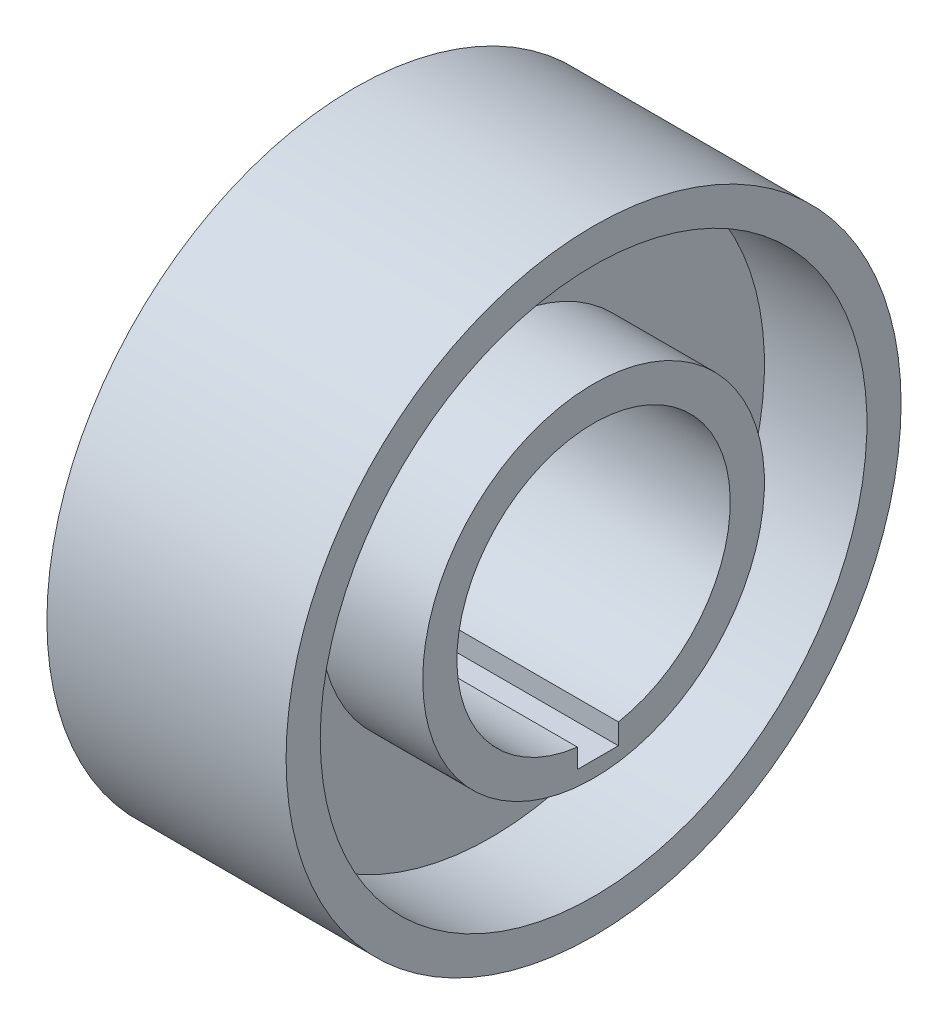
ISO-10303-21;
HEADER;
FILE_DESCRIPTION(('STEP AP214'),'2;1');
FILE_NAME('part.step','',(''),(''),'','','');
FILE_SCHEMA(('AUTOMOTIVE_DESIGN { 1 0 10303 214 1 1 1 1 }'));
ENDSEC;
DATA;
#1=APPLICATION_CONTEXT('core data for automotive mechanical design processes');
#2=APPLICATION_PROTOCOL_DEFINITION('international standard','automotive_design',2000,#1);
#3=PRODUCT_CONTEXT('',#1,'mechanical');
#4=PRODUCT('Part','Part','',(#3));
#5=PRODUCT_RELATED_PRODUCT_CATEGORY('part','',(#4));
#6=PRODUCT_DEFINITION_FORMATION('','',#4);
#7=PRODUCT_DEFINITION_CONTEXT('part definition',#1,'design');
#8=PRODUCT_DEFINITION('design','',#6,#7);
#9=PRODUCT_DEFINITION_SHAPE('','',#8);
#10=(LENGTH_UNIT() NAMED_UNIT(*) SI_UNIT(.MILLI.,.METRE.));
#11=(NAMED_UNIT(*) PLANE_ANGLE_UNIT() SI_UNIT($,.RADIAN.));
#12=(NAMED_UNIT(*) SI_UNIT($,.STERADIAN.) SOLID_ANGLE_UNIT());
#13=UNCERTAINTY_MEASURE_WITH_UNIT(LENGTH_MEASURE(1.E-05),#10,'distance_accuracy_value','');
#14=(GEOMETRIC_REPRESENTATION_CONTEXT(3) GLOBAL_UNCERTAINTY_ASSIGNED_CONTEXT((#13)) GLOBAL_UNIT_ASSIGNED_CONTEXT((#10,
#11,#12)) REPRESENTATION_CONTEXT('',''));
#15=CARTESIAN_POINT('',(0.,0.,0.));
#16=DIRECTION('',(0.,0.,1.));
#17=DIRECTION('',(1.,0.,0.));
#18=AXIS2_PLACEMENT_3D('',#15,#16,#17);
#19=CARTESIAN_POINT('',(35.,0.,-25.));
#20=DIRECTION('',(-1.,0.,0.));
#21=DIRECTION('',(0.,0.,1.));
#22=AXIS2_PLACEMENT_3D('',#19,#20,#21);
#23=PLANE('',#22);
#24=CARTESIAN_POINT('',(35.,0.,0.));
#25=DIRECTION('',(-1.,0.,0.));
#26=DIRECTION('',(0.,0.,1.));
#27=AXIS2_PLACEMENT_3D('',#24,#25,#26);
#28=CIRCLE('',#27,25.);
#29=CARTESIAN_POINT('',(35.,0.,25.));
#30=VERTEX_POINT('',#29);
#31=EDGE_CURVE('E89',#30,#30,#28,.T.);
#32=ORIENTED_EDGE('',*,*,#31,.F.);
#33=EDGE_LOOP('',(#32));
#34=FACE_BOUND('',#33,.T.);
#35=CARTESIAN_POINT('',(35.,0.,0.));
#36=DIRECTION('',(-1.,0.,0.));
#37=DIRECTION('',(0.,0.,1.));
#38=AXIS2_PLACEMENT_3D('',#35,#36,#37);
#39=CIRCLE('',#38,20.);
#40=CARTESIAN_POINT('',(35.,-19.8594099296686,2.36724254046364));
#41=VERTEX_POINT('',#40);
#42=CARTESIAN_POINT('',(35.,-19.6673097611286,-3.63275745953639));
#43=VERTEX_POINT('',#42);
#44=EDGE_CURVE('E12',#41,#43,#39,.T.);
#45=ORIENTED_EDGE('',*,*,#44,.T.);
#46=DIRECTION('',(0.,1.,0.));
#47=VECTOR('',#46,1.);
#48=CARTESIAN_POINT('',(35.,0.,-3.63275745953639));
#49=LINE('',#48,#47);
#50=CARTESIAN_POINT('',(35.,-22.6908639326666,-3.63275745953639));
#51=VERTEX_POINT('',#50);
#52=EDGE_CURVE('E110',#51,#43,#49,.T.);
#53=ORIENTED_EDGE('',*,*,#52,.F.);
#54=DIRECTION('',(0.,0.,-1.));
#55=VECTOR('',#54,1.);
#56=CARTESIAN_POINT('',(35.,-22.6908639326666,0.));
#57=LINE('',#56,#55);
#58=CARTESIAN_POINT('',(35.,-22.6908639326666,2.36724254046361));
#59=VERTEX_POINT('',#58);
#60=EDGE_CURVE('E96',#59,#51,#57,.T.);
#61=ORIENTED_EDGE('',*,*,#60,.F.);
#62=DIRECTION('',(0.,1.,0.));
#63=VECTOR('',#62,1.);
#64=CARTESIAN_POINT('',(35.,0.,2.36724254046361));
#65=LINE('',#64,#63);
#66=EDGE_CURVE('E82',#59,#41,#65,.T.);
#67=ORIENTED_EDGE('',*,*,#66,.T.);
#68=EDGE_LOOP('',(#45,#53,#61,#67));
#69=FACE_BOUND('',#68,.T.);
#70=ADVANCED_FACE('F43',(#34,#69),#23,.F.);
#71=CARTESIAN_POINT('',(0.,0.,0.));
#72=DIRECTION('',(-1.,0.,0.));
#73=DIRECTION('',(0.,0.,1.));
#74=AXIS2_PLACEMENT_3D('',#71,#72,#73);
#75=CYLINDRICAL_SURFACE('',#74,20.);
#76=CARTESIAN_POINT('',(0.,0.,0.));
#77=DIRECTION('',(-1.,0.,0.));
#78=DIRECTION('',(0.,0.,1.));
#79=AXIS2_PLACEMENT_3D('',#76,#77,#78);
#80=CIRCLE('',#79,20.);
#81=CARTESIAN_POINT('',(0.,-19.8594099296686,2.36724254046364));
#82=VERTEX_POINT('',#81);
#83=CARTESIAN_POINT('',(0.,-19.6673097611286,-3.63275745953639));
#84=VERTEX_POINT('',#83);
#85=EDGE_CURVE('E51',#82,#84,#80,.T.);
#86=ORIENTED_EDGE('',*,*,#85,.T.);
#87=DIRECTION('',(-1.,0.,0.));
#88=VECTOR('',#87,1.);
#89=CARTESIAN_POINT('',(0.,-19.6673097611286,-3.63275745953639));
#90=LINE('',#89,#88);
#91=EDGE_CURVE('E98',#84,#43,#90,.F.);
#92=ORIENTED_EDGE('',*,*,#91,.T.);
#93=ORIENTED_EDGE('',*,*,#44,.F.);
#94=DIRECTION('',(1.,0.,0.));
#95=VECTOR('',#94,1.);
#96=CARTESIAN_POINT('',(0.,-19.8594099296686,2.36724254046364));
#97=LINE('',#96,#95);
#98=EDGE_CURVE('E79',#82,#41,#97,.T.);
#99=ORIENTED_EDGE('',*,*,#98,.F.);
#100=EDGE_LOOP('',(#86,#92,#93,#99));
#101=FACE_BOUND('',#100,.T.);
#102=ADVANCED_FACE('F101',(#101),#75,.F.);
#103=CARTESIAN_POINT('',(0.,0.,-20.));
#104=DIRECTION('',(1.,0.,0.));
#105=DIRECTION('',(0.,0.,-1.));
#106=AXIS2_PLACEMENT_3D('',#103,#104,#105);
#107=PLANE('',#106);
#108=CARTESIAN_POINT('',(0.,0.,0.));
#109=DIRECTION('',(-1.,0.,0.));
#110=DIRECTION('',(0.,0.,1.));
#111=AXIS2_PLACEMENT_3D('',#108,#109,#110);
#112=CIRCLE('',#111,25.);
#113=CARTESIAN_POINT('',(0.,0.,25.));
#114=VERTEX_POINT('',#113);
#115=EDGE_CURVE('E160',#114,#114,#112,.T.);
#116=ORIENTED_EDGE('',*,*,#115,.T.);
#117=EDGE_LOOP('',(#116));
#118=FACE_BOUND('',#117,.T.);
#119=DIRECTION('',(0.,1.,0.));
#120=VECTOR('',#119,1.);
#121=CARTESIAN_POINT('',(0.,0.,-3.63275745953639));
#122=LINE('',#121,#120);
#123=CARTESIAN_POINT('',(0.,-22.6908639326666,-3.63275745953639));
#124=VERTEX_POINT('',#123);
#125=EDGE_CURVE('E58',#124,#84,#122,.T.);
#126=ORIENTED_EDGE('',*,*,#125,.T.);
#127=ORIENTED_EDGE('',*,*,#85,.F.);
#128=DIRECTION('',(0.,1.,0.));
#129=VECTOR('',#128,1.);
#130=CARTESIAN_POINT('',(0.,0.,2.36724254046361));
#131=LINE('',#130,#129);
#132=CARTESIAN_POINT('',(0.,-22.6908639326666,2.36724254046361));
#133=VERTEX_POINT('',#132);
#134=EDGE_CURVE('E67',#133,#82,#131,.T.);
#135=ORIENTED_EDGE('',*,*,#134,.F.);
#136=DIRECTION('',(0.,0.,-1.));
#137=VECTOR('',#136,1.);
#138=CARTESIAN_POINT('',(0.,-22.6908639326666,0.));
#139=LINE('',#138,#137);
#140=EDGE_CURVE('E109',#133,#124,#139,.T.);
#141=ORIENTED_EDGE('',*,*,#140,.T.);
#142=EDGE_LOOP('',(#126,#127,#135,#141));
#143=FACE_BOUND('',#142,.T.);
#144=ADVANCED_FACE('F166',(#118,#143),#107,.F.);
#145=CARTESIAN_POINT('',(0.,0.,0.));
#146=DIRECTION('',(-1.,0.,0.));
#147=DIRECTION('',(0.,0.,1.));
#148=AXIS2_PLACEMENT_3D('',#145,#146,#147);
#149=CYLINDRICAL_SURFACE('',#148,25.);
#150=ORIENTED_EDGE('',*,*,#115,.F.);
#151=EDGE_LOOP('',(#150));
#152=FACE_BOUND('',#151,.T.);
#153=CARTESIAN_POINT('',(15.,0.,0.));
#154=DIRECTION('',(-1.,0.,0.));
#155=DIRECTION('',(0.,0.,1.));
#156=AXIS2_PLACEMENT_3D('',#153,#154,#155);
#157=CIRCLE('',#156,25.);
#158=CARTESIAN_POINT('',(15.,0.,25.));
#159=VERTEX_POINT('',#158);
#160=EDGE_CURVE('E156',#159,#159,#157,.T.);
#161=ORIENTED_EDGE('',*,*,#160,.T.);
#162=EDGE_LOOP('',(#161));
#163=FACE_BOUND('',#162,.T.);
#164=ADVANCED_FACE('F169',(#152,#163),#149,.T.);
#165=CARTESIAN_POINT('',(15.,0.,-25.));
#166=DIRECTION('',(1.,0.,0.));
#167=DIRECTION('',(0.,0.,-1.));
#168=AXIS2_PLACEMENT_3D('',#165,#166,#167);
#169=PLANE('',#168);
#170=ORIENTED_EDGE('',*,*,#160,.F.);
#171=EDGE_LOOP('',(#170));
#172=FACE_BOUND('',#171,.T.);
#173=CARTESIAN_POINT('',(15.,0.,0.));
#174=DIRECTION('',(-1.,0.,0.));
#175=DIRECTION('',(0.,0.,1.));
#176=AXIS2_PLACEMENT_3D('',#173,#174,#175);
#177=CIRCLE('',#176,40.);
#178=CARTESIAN_POINT('',(15.,0.,40.));
#179=VERTEX_POINT('',#178);
#180=EDGE_CURVE('E152',#179,#179,#177,.T.);
#181=ORIENTED_EDGE('',*,*,#180,.T.);
#182=EDGE_LOOP('',(#181));
#183=FACE_BOUND('',#182,.T.);
#184=ADVANCED_FACE('F172',(#172,#183),#169,.F.);
#185=CARTESIAN_POINT('',(0.,0.,0.));
#186=DIRECTION('',(-1.,0.,0.));
#187=DIRECTION('',(0.,0.,1.));
#188=AXIS2_PLACEMENT_3D('',#185,#186,#187);
#189=CYLINDRICAL_SURFACE('',#188,40.);
#190=ORIENTED_EDGE('',*,*,#180,.F.);
#191=EDGE_LOOP('',(#190));
#192=FACE_BOUND('',#191,.T.);
#193=CARTESIAN_POINT('',(0.,0.,0.));
#194=DIRECTION('',(-1.,0.,0.));
#195=DIRECTION('',(0.,0.,1.));
#196=AXIS2_PLACEMENT_3D('',#193,#194,#195);
#197=CIRCLE('',#196,40.);
#198=CARTESIAN_POINT('',(0.,0.,40.));
#199=VERTEX_POINT('',#198);
#200=EDGE_CURVE('E148',#199,#199,#197,.T.);
#201=ORIENTED_EDGE('',*,*,#200,.T.);
#202=EDGE_LOOP('',(#201));
#203=FACE_BOUND('',#202,.T.);
#204=ADVANCED_FACE('F178',(#192,#203),#189,.F.);
#205=CARTESIAN_POINT('',(0.,0.,-40.));
#206=DIRECTION('',(1.,0.,0.));
#207=DIRECTION('',(0.,0.,-1.));
#208=AXIS2_PLACEMENT_3D('',#205,#206,#207);
#209=PLANE('',#208);
#210=ORIENTED_EDGE('',*,*,#200,.F.);
#211=EDGE_LOOP('',(#210));
#212=FACE_BOUND('',#211,.T.);
#213=CARTESIAN_POINT('',(0.,0.,0.));
#214=DIRECTION('',(-1.,0.,0.));
#215=DIRECTION('',(0.,0.,1.));
#216=AXIS2_PLACEMENT_3D('',#213,#214,#215);
#217=CIRCLE('',#216,45.);
#218=CARTESIAN_POINT('',(0.,0.,45.));
#219=VERTEX_POINT('',#218);
#220=EDGE_CURVE('E144',#219,#219,#217,.T.);
#221=ORIENTED_EDGE('',*,*,#220,.T.);
#222=EDGE_LOOP('',(#221));
#223=FACE_BOUND('',#222,.T.);
#224=ADVANCED_FACE('F184',(#212,#223),#209,.F.);
#225=CARTESIAN_POINT('',(0.,0.,0.));
#226=DIRECTION('',(-1.,0.,0.));
#227=DIRECTION('',(0.,0.,1.));
#228=AXIS2_PLACEMENT_3D('',#225,#226,#227);
#229=CYLINDRICAL_SURFACE('',#228,45.);
#230=ORIENTED_EDGE('',*,*,#220,.F.);
#231=EDGE_LOOP('',(#230));
#232=FACE_BOUND('',#231,.T.);
#233=CARTESIAN_POINT('',(35.,0.,0.));
#234=DIRECTION('',(-1.,0.,0.));
#235=DIRECTION('',(0.,0.,1.));
#236=AXIS2_PLACEMENT_3D('',#233,#234,#235);
#237=CIRCLE('',#236,45.);
#238=CARTESIAN_POINT('',(35.,0.,45.));
#239=VERTEX_POINT('',#238);
#240=EDGE_CURVE('E140',#239,#239,#237,.T.);
#241=ORIENTED_EDGE('',*,*,#240,.T.);
#242=EDGE_LOOP('',(#241));
#243=FACE_BOUND('',#242,.T.);
#244=ADVANCED_FACE('F190',(#232,#243),#229,.T.);
#245=CARTESIAN_POINT('',(35.,0.,-45.));
#246=DIRECTION('',(-1.,0.,0.));
#247=DIRECTION('',(0.,0.,1.));
#248=AXIS2_PLACEMENT_3D('',#245,#246,#247);
#249=PLANE('',#248);
#250=ORIENTED_EDGE('',*,*,#240,.F.);
#251=EDGE_LOOP('',(#250));
#252=FACE_BOUND('',#251,.T.);
#253=CARTESIAN_POINT('',(35.,0.,0.));
#254=DIRECTION('',(-1.,0.,0.));
#255=DIRECTION('',(0.,0.,1.));
#256=AXIS2_PLACEMENT_3D('',#253,#254,#255);
#257=CIRCLE('',#256,40.);
#258=CARTESIAN_POINT('',(35.,0.,40.));
#259=VERTEX_POINT('',#258);
#260=EDGE_CURVE('E136',#259,#259,#257,.T.);
#261=ORIENTED_EDGE('',*,*,#260,.T.);
#262=EDGE_LOOP('',(#261));
#263=FACE_BOUND('',#262,.T.);
#264=ADVANCED_FACE('F196',(#252,#263),#249,.F.);
#265=CARTESIAN_POINT('',(0.,0.,0.));
#266=DIRECTION('',(-1.,0.,0.));
#267=DIRECTION('',(0.,0.,1.));
#268=AXIS2_PLACEMENT_3D('',#265,#266,#267);
#269=CYLINDRICAL_SURFACE('',#268,40.);
#270=ORIENTED_EDGE('',*,*,#260,.F.);
#271=EDGE_LOOP('',(#270));
#272=FACE_BOUND('',#271,.T.);
#273=CARTESIAN_POINT('',(20.,0.,0.));
#274=DIRECTION('',(-1.,0.,0.));
#275=DIRECTION('',(0.,0.,1.));
#276=AXIS2_PLACEMENT_3D('',#273,#274,#275);
#277=CIRCLE('',#276,40.);
#278=CARTESIAN_POINT('',(20.,0.,40.));
#279=VERTEX_POINT('',#278);
#280=EDGE_CURVE('E132',#279,#279,#277,.T.);
#281=ORIENTED_EDGE('',*,*,#280,.T.);
#282=EDGE_LOOP('',(#281));
#283=FACE_BOUND('',#282,.T.);
#284=ADVANCED_FACE('F202',(#272,#283),#269,.F.);
#285=CARTESIAN_POINT('',(20.,0.,-40.));
#286=DIRECTION('',(-1.,0.,0.));
#287=DIRECTION('',(0.,0.,1.));
#288=AXIS2_PLACEMENT_3D('',#285,#286,#287);
#289=PLANE('',#288);
#290=ORIENTED_EDGE('',*,*,#280,.F.);
#291=EDGE_LOOP('',(#290));
#292=FACE_BOUND('',#291,.T.);
#293=CARTESIAN_POINT('',(20.,0.,0.));
#294=DIRECTION('',(-1.,0.,0.));
#295=DIRECTION('',(0.,0.,1.));
#296=AXIS2_PLACEMENT_3D('',#293,#294,#295);
#297=CIRCLE('',#296,25.);
#298=CARTESIAN_POINT('',(20.,0.,25.));
#299=VERTEX_POINT('',#298);
#300=EDGE_CURVE('E128',#299,#299,#297,.T.);
#301=ORIENTED_EDGE('',*,*,#300,.T.);
#302=EDGE_LOOP('',(#301));
#303=FACE_BOUND('',#302,.T.);
#304=ADVANCED_FACE('F208',(#292,#303),#289,.F.);
#305=CARTESIAN_POINT('',(0.,0.,0.));
#306=DIRECTION('',(-1.,0.,0.));
#307=DIRECTION('',(0.,0.,1.));
#308=AXIS2_PLACEMENT_3D('',#305,#306,#307);
#309=CYLINDRICAL_SURFACE('',#308,25.);
#310=ORIENTED_EDGE('',*,*,#300,.F.);
#311=EDGE_LOOP('',(#310));
#312=FACE_BOUND('',#311,.T.);
#313=ORIENTED_EDGE('',*,*,#31,.T.);
#314=EDGE_LOOP('',(#313));
#315=FACE_BOUND('',#314,.T.);
#316=ADVANCED_FACE('F214',(#312,#315),#309,.T.);
#317=CARTESIAN_POINT('',(0.,0.,2.36724254046361));
#318=DIRECTION('',(0.,0.,-1.));
#319=DIRECTION('',(-1.,0.,0.));
#320=AXIS2_PLACEMENT_3D('',#317,#318,#319);
#321=PLANE('',#320);
#322=ORIENTED_EDGE('',*,*,#66,.F.);
#323=DIRECTION('',(1.,0.,0.));
#324=VECTOR('',#323,1.);
#325=CARTESIAN_POINT('',(0.,-22.6908639326666,2.36724254046361));
#326=LINE('',#325,#324);
#327=EDGE_CURVE('E115',#133,#59,#326,.T.);
#328=ORIENTED_EDGE('',*,*,#327,.F.);
#329=ORIENTED_EDGE('',*,*,#134,.T.);
#330=ORIENTED_EDGE('',*,*,#98,.T.);
#331=EDGE_LOOP('',(#322,#328,#329,#330));
#332=FACE_BOUND('',#331,.T.);
#333=ADVANCED_FACE('F81',(#332),#321,.T.);
#334=CARTESIAN_POINT('',(0.,0.,-3.63275745953639));
#335=DIRECTION('',(0.,0.,-1.));
#336=DIRECTION('',(-1.,0.,0.));
#337=AXIS2_PLACEMENT_3D('',#334,#335,#336);
#338=PLANE('',#337);
#339=ORIENTED_EDGE('',*,*,#52,.T.);
#340=ORIENTED_EDGE('',*,*,#91,.F.);
#341=ORIENTED_EDGE('',*,*,#125,.F.);
#342=DIRECTION('',(1.,0.,0.));
#343=VECTOR('',#342,1.);
#344=CARTESIAN_POINT('',(0.,-22.6908639326666,-3.63275745953639));
#345=LINE('',#344,#343);
#346=EDGE_CURVE('E90',#124,#51,#345,.T.);
#347=ORIENTED_EDGE('',*,*,#346,.T.);
#348=EDGE_LOOP('',(#339,#340,#341,#347));
#349=FACE_BOUND('',#348,.T.);
#350=ADVANCED_FACE('F234',(#349),#338,.F.);
#351=CARTESIAN_POINT('',(0.,-22.6908639326666,0.));
#352=DIRECTION('',(0.,-1.,0.));
#353=DIRECTION('',(0.,0.,-1.));
#354=AXIS2_PLACEMENT_3D('',#351,#352,#353);
#355=PLANE('',#354);
#356=ORIENTED_EDGE('',*,*,#60,.T.);
#357=ORIENTED_EDGE('',*,*,#346,.F.);
#358=ORIENTED_EDGE('',*,*,#140,.F.);
#359=ORIENTED_EDGE('',*,*,#327,.T.);
#360=EDGE_LOOP('',(#356,#357,#358,#359));
#361=FACE_BOUND('',#360,.T.);
#362=ADVANCED_FACE('F235',(#361),#355,.F.);
#363=CLOSED_SHELL('',(#70,#102,#144,#164,#184,#204,#224,#244,#264,#284,#304,#316,#333,#350,#362));
#364=MANIFOLD_SOLID_BREP('B2',#363);
#365=ADVANCED_BREP_SHAPE_REPRESENTATION('',(#18,#364),#14);
#366=SHAPE_DEFINITION_REPRESENTATION(#9,#365);
ENDSEC;
END-ISO-10303-21;
